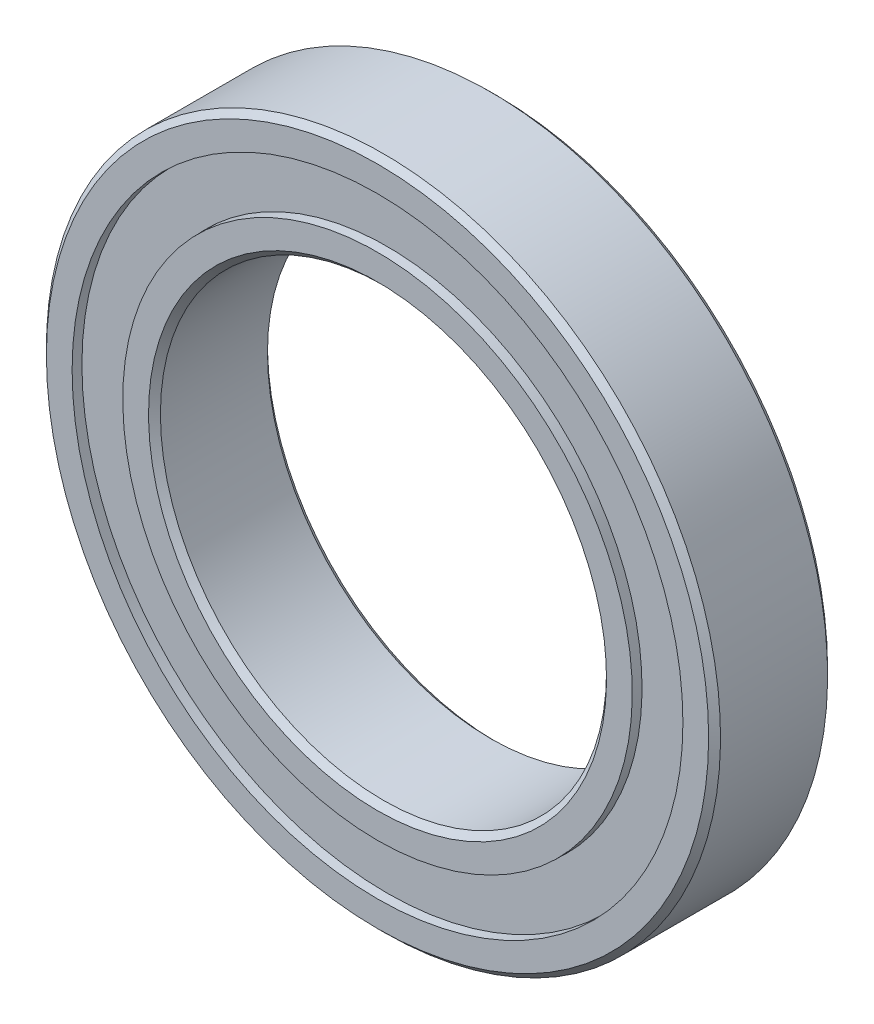
ISO-10303-21;
HEADER;
FILE_DESCRIPTION(('STEP AP214'),'2;1');
FILE_NAME('part.step','',(''),(''),'','','');
FILE_SCHEMA(('AUTOMOTIVE_DESIGN { 1 0 10303 214 1 1 1 1 }'));
ENDSEC;
DATA;
#1=APPLICATION_CONTEXT('core data for automotive mechanical design processes');
#2=APPLICATION_PROTOCOL_DEFINITION('international standard','automotive_design',2000,#1);
#3=PRODUCT_CONTEXT('',#1,'mechanical');
#4=PRODUCT('Part','Part','',(#3));
#5=PRODUCT_RELATED_PRODUCT_CATEGORY('part','',(#4));
#6=PRODUCT_DEFINITION_FORMATION('','',#4);
#7=PRODUCT_DEFINITION_CONTEXT('part definition',#1,'design');
#8=PRODUCT_DEFINITION('design','',#6,#7);
#9=PRODUCT_DEFINITION_SHAPE('','',#8);
#10=(LENGTH_UNIT() NAMED_UNIT(*) SI_UNIT(.MILLI.,.METRE.));
#11=(NAMED_UNIT(*) PLANE_ANGLE_UNIT() SI_UNIT($,.RADIAN.));
#12=(NAMED_UNIT(*) SI_UNIT($,.STERADIAN.) SOLID_ANGLE_UNIT());
#13=UNCERTAINTY_MEASURE_WITH_UNIT(LENGTH_MEASURE(1.E-05),#10,'distance_accuracy_value','');
#14=(GEOMETRIC_REPRESENTATION_CONTEXT(3) GLOBAL_UNCERTAINTY_ASSIGNED_CONTEXT((#13)) GLOBAL_UNIT_ASSIGNED_CONTEXT((#10,
#11,#12)) REPRESENTATION_CONTEXT('',''));
#15=CARTESIAN_POINT('',(0.,0.,0.));
#16=DIRECTION('',(0.,0.,1.));
#17=DIRECTION('',(1.,0.,0.));
#18=AXIS2_PLACEMENT_3D('',#15,#16,#17);
#19=CARTESIAN_POINT('',(11.490310166891,25.8076591784036,0.));
#20=DIRECTION('',(0.,0.,1.));
#21=DIRECTION('',(0.406736643075789,0.913545457642606,0.));
#22=AXIS2_PLACEMENT_3D('',#19,#20,#21);
#23=SPHERICAL_SURFACE('',#22,3.69350447524326);
#24=CARTESIAN_POINT('',(11.490310166891,25.8076591784036,3.69350447524325));
#25=VERTEX_POINT('',#24);
#26=VERTEX_LOOP('',#25);
#27=FACE_BOUND('',#26,.T.);
#28=ADVANCED_FACE('F39',(#27),#23,.T.);
#29=CLOSED_SHELL('',(#28));
#30=MANIFOLD_SOLID_BREP('B2',#29);
#31=CARTESIAN_POINT('',(20.9938413197362,18.902939629638,0.));
#32=DIRECTION('',(0.,0.,1.));
#33=DIRECTION('',(0.743144825477386,0.669130606358867,0.));
#34=AXIS2_PLACEMENT_3D('',#31,#32,#33);
#35=SPHERICAL_SURFACE('',#34,3.69350447524326);
#36=CARTESIAN_POINT('',(20.9938413197362,18.902939629638,3.69350447524325));
#37=VERTEX_POINT('',#36);
#38=VERTEX_LOOP('',#37);
#39=FACE_BOUND('',#38,.T.);
#40=ADVANCED_FACE('F59',(#39),#35,.T.);
#41=CLOSED_SHELL('',(#40));
#42=MANIFOLD_SOLID_BREP('B6',#41);
#43=CARTESIAN_POINT('',(26.867346585338,8.72973009109255,0.));
#44=DIRECTION('',(0.,0.,1.));
#45=DIRECTION('',(0.95105651629515,0.309016994374957,0.));
#46=AXIS2_PLACEMENT_3D('',#43,#44,#45);
#47=SPHERICAL_SURFACE('',#46,3.69350447524326);
#48=CARTESIAN_POINT('',(26.867346585338,8.72973009109255,3.69350447524325));
#49=VERTEX_POINT('',#48);
#50=VERTEX_LOOP('',#49);
#51=FACE_BOUND('',#50,.T.);
#52=ADVANCED_FACE('F79',(#51),#47,.T.);
#53=CLOSED_SHELL('',(#52));
#54=MANIFOLD_SOLID_BREP('B35',#53);
#55=CARTESIAN_POINT('',(28.0952435441538,-2.95292908731093,0.));
#56=DIRECTION('',(0.,0.,1.));
#57=DIRECTION('',(0.994521895368274,-0.104528463267644,0.));
#58=AXIS2_PLACEMENT_3D('',#55,#56,#57);
#59=SPHERICAL_SURFACE('',#58,3.69350447524326);
#60=CARTESIAN_POINT('',(28.0952435441538,-2.95292908731093,3.69350447524325));
#61=VERTEX_POINT('',#60);
#62=VERTEX_LOOP('',#61);
#63=FACE_BOUND('',#62,.T.);
#64=ADVANCED_FACE('F99',(#63),#59,.T.);
#65=CLOSED_SHELL('',(#64));
#66=MANIFOLD_SOLID_BREP('B55',#65);
#67=CARTESIAN_POINT('',(24.4652176569105,-14.1249999999998,0.));
#68=DIRECTION('',(0.,0.,1.));
#69=DIRECTION('',(0.866025403784443,-0.499999999999992,0.));
#70=AXIS2_PLACEMENT_3D('',#67,#68,#69);
#71=SPHERICAL_SURFACE('',#70,3.69350447524326);
#72=CARTESIAN_POINT('',(24.4652176569105,-14.1249999999998,3.69350447524325));
#73=VERTEX_POINT('',#72);
#74=VERTEX_LOOP('',#73);
#75=FACE_BOUND('',#74,.T.);
#76=ADVANCED_FACE('F119',(#75),#71,.T.);
#77=CLOSED_SHELL('',(#76));
#78=MANIFOLD_SOLID_BREP('B75',#77);
#79=CARTESIAN_POINT('',(16.6049333772626,-22.8547300910921,0.));
#80=DIRECTION('',(0.,0.,1.));
#81=DIRECTION('',(0.58778525229248,-0.809016994374943,0.));
#82=AXIS2_PLACEMENT_3D('',#79,#80,#81);
#83=SPHERICAL_SURFACE('',#82,3.69350447524326);
#84=CARTESIAN_POINT('',(16.6049333772626,-22.8547300910921,3.69350447524325));
#85=VERTEX_POINT('',#84);
#86=VERTEX_LOOP('',#85);
#87=FACE_BOUND('',#86,.T.);
#88=ADVANCED_FACE('F139',(#87),#83,.T.);
#89=CLOSED_SHELL('',(#88));
#90=MANIFOLD_SOLID_BREP('B95',#89);
#91=CARTESIAN_POINT('',(5.8735052656019,-27.63266972073,0.));
#92=DIRECTION('',(0.,0.,1.));
#93=DIRECTION('',(0.207911690817766,-0.978147600733804,0.));
#94=AXIS2_PLACEMENT_3D('',#91,#92,#93);
#95=SPHERICAL_SURFACE('',#94,3.69350447524326);
#96=CARTESIAN_POINT('',(5.8735052656019,-27.63266972073,3.69350447524325));
#97=VERTEX_POINT('',#96);
#98=VERTEX_LOOP('',#97);
#99=FACE_BOUND('',#98,.T.);
#100=ADVANCED_FACE('F159',(#99),#95,.T.);
#101=CLOSED_SHELL('',(#100));
#102=MANIFOLD_SOLID_BREP('B115',#101);
#103=CARTESIAN_POINT('',(-5.87350526560153,-27.63266972073,0.));
#104=DIRECTION('',(0.,0.,1.));
#105=DIRECTION('',(-0.207911690817753,-0.978147600733807,0.));
#106=AXIS2_PLACEMENT_3D('',#103,#104,#105);
#107=SPHERICAL_SURFACE('',#106,3.69350447524326);
#108=CARTESIAN_POINT('',(-5.87350526560153,-27.63266972073,3.69350447524325));
#109=VERTEX_POINT('',#108);
#110=VERTEX_LOOP('',#109);
#111=FACE_BOUND('',#110,.T.);
#112=ADVANCED_FACE('F179',(#111),#107,.T.);
#113=CLOSED_SHELL('',(#112));
#114=MANIFOLD_SOLID_BREP('B135',#113);
#115=CARTESIAN_POINT('',(-16.6049333772622,-22.8547300910924,0.));
#116=DIRECTION('',(0.,0.,1.));
#117=DIRECTION('',(-0.587785252292469,-0.80901699437495,0.));
#118=AXIS2_PLACEMENT_3D('',#115,#116,#117);
#119=SPHERICAL_SURFACE('',#118,3.69350447524326);
#120=CARTESIAN_POINT('',(-16.6049333772622,-22.8547300910924,3.69350447524325));
#121=VERTEX_POINT('',#120);
#122=VERTEX_LOOP('',#121);
#123=FACE_BOUND('',#122,.T.);
#124=ADVANCED_FACE('F199',(#123),#119,.T.);
#125=CLOSED_SHELL('',(#124));
#126=MANIFOLD_SOLID_BREP('B155',#125);
#127=CARTESIAN_POINT('',(-24.4652176569103,-14.1250000000001,0.));
#128=DIRECTION('',(0.,0.,1.));
#129=DIRECTION('',(-0.866025403784436,-0.500000000000004,0.));
#130=AXIS2_PLACEMENT_3D('',#127,#128,#129);
#131=SPHERICAL_SURFACE('',#130,3.69350447524326);
#132=CARTESIAN_POINT('',(-24.4652176569103,-14.1250000000001,3.69350447524325));
#133=VERTEX_POINT('',#132);
#134=VERTEX_LOOP('',#133);
#135=FACE_BOUND('',#134,.T.);
#136=ADVANCED_FACE('F219',(#135),#131,.T.);
#137=CLOSED_SHELL('',(#136));
#138=MANIFOLD_SOLID_BREP('B175',#137);
#139=CARTESIAN_POINT('',(-28.0952435441537,-2.95292908731131,0.));
#140=DIRECTION('',(0.,0.,1.));
#141=DIRECTION('',(-0.994521895368273,-0.104528463267657,0.));
#142=AXIS2_PLACEMENT_3D('',#139,#140,#141);
#143=SPHERICAL_SURFACE('',#142,3.69350447524326);
#144=CARTESIAN_POINT('',(-28.0952435441537,-2.95292908731131,3.69350447524325));
#145=VERTEX_POINT('',#144);
#146=VERTEX_LOOP('',#145);
#147=FACE_BOUND('',#146,.T.);
#148=ADVANCED_FACE('F239',(#147),#143,.T.);
#149=CLOSED_SHELL('',(#148));
#150=MANIFOLD_SOLID_BREP('B195',#149);
#151=CARTESIAN_POINT('',(-26.8673465853381,8.7297300910922,0.));
#152=DIRECTION('',(0.,0.,1.));
#153=DIRECTION('',(-0.951056516295154,0.309016994374945,0.));
#154=AXIS2_PLACEMENT_3D('',#151,#152,#153);
#155=SPHERICAL_SURFACE('',#154,3.69350447524326);
#156=CARTESIAN_POINT('',(-26.8673465853381,8.7297300910922,3.69350447524325));
#157=VERTEX_POINT('',#156);
#158=VERTEX_LOOP('',#157);
#159=FACE_BOUND('',#158,.T.);
#160=ADVANCED_FACE('F259',(#159),#155,.T.);
#161=CLOSED_SHELL('',(#160));
#162=MANIFOLD_SOLID_BREP('B215',#161);
#163=CARTESIAN_POINT('',(-20.9938413197364,18.9029396296377,0.));
#164=DIRECTION('',(0.,0.,1.));
#165=DIRECTION('',(-0.743144825477395,0.669130606358857,0.));
#166=AXIS2_PLACEMENT_3D('',#163,#164,#165);
#167=SPHERICAL_SURFACE('',#166,3.69350447524326);
#168=CARTESIAN_POINT('',(-20.9938413197364,18.9029396296377,3.69350447524325));
#169=VERTEX_POINT('',#168);
#170=VERTEX_LOOP('',#169);
#171=FACE_BOUND('',#170,.T.);
#172=ADVANCED_FACE('F279',(#171),#167,.T.);
#173=CLOSED_SHELL('',(#172));
#174=MANIFOLD_SOLID_BREP('B235',#173);
#175=CARTESIAN_POINT('',(-11.4903101668914,25.8076591784035,0.));
#176=DIRECTION('',(0.,0.,1.));
#177=DIRECTION('',(-0.406736643075801,0.913545457642601,0.));
#178=AXIS2_PLACEMENT_3D('',#175,#176,#177);
#179=SPHERICAL_SURFACE('',#178,3.69350447524326);
#180=CARTESIAN_POINT('',(-11.4903101668914,25.8076591784035,3.69350447524325));
#181=VERTEX_POINT('',#180);
#182=VERTEX_LOOP('',#181);
#183=FACE_BOUND('',#182,.T.);
#184=ADVANCED_FACE('F299',(#183),#179,.T.);
#185=CLOSED_SHELL('',(#184));
#186=MANIFOLD_SOLID_BREP('B255',#185);
#187=CARTESIAN_POINT('',(0.,28.25,0.));
#188=DIRECTION('',(0.,0.,1.));
#189=DIRECTION('',(0.,1.,0.));
#190=AXIS2_PLACEMENT_3D('',#187,#188,#189);
#191=SPHERICAL_SURFACE('',#190,3.69350447524326);
#192=CARTESIAN_POINT('',(0.,28.25,3.69350447524325));
#193=VERTEX_POINT('',#192);
#194=VERTEX_LOOP('',#193);
#195=FACE_BOUND('',#194,.T.);
#196=ADVANCED_FACE('F321',(#195),#191,.T.);
#197=CLOSED_SHELL('',(#196));
#198=MANIFOLD_SOLID_BREP('B275',#197);
#199=CARTESIAN_POINT('',(0.,25.6944444444445,6.00000000000003));
#200=DIRECTION('',(0.,0.,-1.));
#201=DIRECTION('',(0.,1.,0.));
#202=AXIS2_PLACEMENT_3D('',#199,#200,#201);
#203=PLANE('',#202);
#204=CARTESIAN_POINT('',(0.,0.,6.00000000000002));
#205=DIRECTION('',(0.,0.,1.));
#206=DIRECTION('',(0.,-1.,0.));
#207=AXIS2_PLACEMENT_3D('',#204,#205,#206);
#208=CIRCLE('',#207,23.1);
#209=CARTESIAN_POINT('',(0.,-23.1,6.00000000000002));
#210=VERTEX_POINT('',#209);
#211=EDGE_CURVE('E369',#210,#210,#208,.T.);
#212=ORIENTED_EDGE('',*,*,#211,.F.);
#213=EDGE_LOOP('',(#212));
#214=FACE_BOUND('',#213,.T.);
#215=CARTESIAN_POINT('',(0.,0.,6.00000000000002));
#216=DIRECTION('',(0.,0.,1.));
#217=DIRECTION('',(0.,-1.,0.));
#218=AXIS2_PLACEMENT_3D('',#215,#216,#217);
#219=CIRCLE('',#218,25.6944444444445);
#220=CARTESIAN_POINT('',(0.,-25.6944444444445,6.00000000000002));
#221=VERTEX_POINT('',#220);
#222=EDGE_CURVE('E320',#221,#221,#219,.T.);
#223=ORIENTED_EDGE('',*,*,#222,.T.);
#224=EDGE_LOOP('',(#223));
#225=FACE_BOUND('',#224,.T.);
#226=ADVANCED_FACE('F341',(#214,#225),#203,.F.);
#227=CARTESIAN_POINT('',(0.,0.,6.00000000000002));
#228=DIRECTION('',(0.,0.,1.));
#229=DIRECTION('',(0.,-1.,0.));
#230=AXIS2_PLACEMENT_3D('',#227,#228,#229);
#231=CYLINDRICAL_SURFACE('',#230,25.6944444444445);
#232=ORIENTED_EDGE('',*,*,#222,.F.);
#233=EDGE_LOOP('',(#232));
#234=FACE_BOUND('',#233,.T.);
#235=CARTESIAN_POINT('',(0.,0.,2.66666666666666));
#236=DIRECTION('',(0.,0.,1.));
#237=DIRECTION('',(0.,-1.,0.));
#238=AXIS2_PLACEMENT_3D('',#235,#236,#237);
#239=CIRCLE('',#238,25.6944444444445);
#240=CARTESIAN_POINT('',(0.,-25.6944444444445,2.66666666666666));
#241=VERTEX_POINT('',#240);
#242=EDGE_CURVE('E347',#241,#241,#239,.T.);
#243=ORIENTED_EDGE('',*,*,#242,.T.);
#244=EDGE_LOOP('',(#243));
#245=FACE_BOUND('',#244,.T.);
#246=ADVANCED_FACE('F376',(#234,#245),#231,.T.);
#247=CARTESIAN_POINT('',(0.,0.,0.));
#248=DIRECTION('',(0.,0.,1.));
#249=DIRECTION('',(0.,-1.,0.));
#250=AXIS2_PLACEMENT_3D('',#247,#248,#249);
#251=TOROIDAL_SURFACE('',#250,28.25,3.69350447524326);
#252=ORIENTED_EDGE('',*,*,#242,.F.);
#253=EDGE_LOOP('',(#252));
#254=FACE_BOUND('',#253,.T.);
#255=CARTESIAN_POINT('',(0.,0.,-2.66666666666667));
#256=DIRECTION('',(0.,0.,1.));
#257=DIRECTION('',(0.,-1.,0.));
#258=AXIS2_PLACEMENT_3D('',#255,#256,#257);
#259=CIRCLE('',#258,25.6944444444445);
#260=CARTESIAN_POINT('',(0.,-25.6944444444445,-2.66666666666667));
#261=VERTEX_POINT('',#260);
#262=EDGE_CURVE('E351',#261,#261,#259,.T.);
#263=ORIENTED_EDGE('',*,*,#262,.T.);
#264=EDGE_LOOP('',(#263));
#265=FACE_BOUND('',#264,.T.);
#266=ADVANCED_FACE('F380',(#254,#265),#251,.F.);
#267=CARTESIAN_POINT('',(0.,0.,6.00000000000002));
#268=DIRECTION('',(0.,0.,1.));
#269=DIRECTION('',(0.,-1.,0.));
#270=AXIS2_PLACEMENT_3D('',#267,#268,#269);
#271=CYLINDRICAL_SURFACE('',#270,25.6944444444445);
#272=ORIENTED_EDGE('',*,*,#262,.F.);
#273=EDGE_LOOP('',(#272));
#274=FACE_BOUND('',#273,.T.);
#275=CARTESIAN_POINT('',(0.,0.,-6.00000000000003));
#276=DIRECTION('',(0.,0.,1.));
#277=DIRECTION('',(0.,-1.,0.));
#278=AXIS2_PLACEMENT_3D('',#275,#276,#277);
#279=CIRCLE('',#278,25.6944444444445);
#280=CARTESIAN_POINT('',(0.,-25.6944444444445,-6.00000000000003));
#281=VERTEX_POINT('',#280);
#282=EDGE_CURVE('E355',#281,#281,#279,.T.);
#283=ORIENTED_EDGE('',*,*,#282,.T.);
#284=EDGE_LOOP('',(#283));
#285=FACE_BOUND('',#284,.T.);
#286=ADVANCED_FACE('F385',(#274,#285),#271,.T.);
#287=CARTESIAN_POINT('',(0.,23.1,-6.00000000000003));
#288=DIRECTION('',(0.,0.,1.));
#289=DIRECTION('',(0.,-1.,0.));
#290=AXIS2_PLACEMENT_3D('',#287,#288,#289);
#291=PLANE('',#290);
#292=ORIENTED_EDGE('',*,*,#282,.F.);
#293=EDGE_LOOP('',(#292));
#294=FACE_BOUND('',#293,.T.);
#295=CARTESIAN_POINT('',(0.,0.,-6.00000000000003));
#296=DIRECTION('',(0.,0.,1.));
#297=DIRECTION('',(0.,-1.,0.));
#298=AXIS2_PLACEMENT_3D('',#295,#296,#297);
#299=CIRCLE('',#298,23.1);
#300=CARTESIAN_POINT('',(0.,-23.1,-6.00000000000003));
#301=VERTEX_POINT('',#300);
#302=EDGE_CURVE('E360',#301,#301,#299,.T.);
#303=ORIENTED_EDGE('',*,*,#302,.T.);
#304=EDGE_LOOP('',(#303));
#305=FACE_BOUND('',#304,.T.);
#306=ADVANCED_FACE('F391',(#294,#305),#291,.F.);
#307=CARTESIAN_POINT('',(0.,0.,-5.40000000000003));
#308=DIRECTION('',(0.,0.,-1.));
#309=DIRECTION('',(0.,1.,0.));
#310=AXIS2_PLACEMENT_3D('',#307,#308,#309);
#311=CONICAL_SURFACE('',#310,22.5,0.785398163397431);
#312=ORIENTED_EDGE('',*,*,#302,.F.);
#313=EDGE_LOOP('',(#312));
#314=FACE_BOUND('',#313,.T.);
#315=CARTESIAN_POINT('',(0.,0.,-5.40000000000003));
#316=DIRECTION('',(0.,0.,1.));
#317=DIRECTION('',(0.,-1.,0.));
#318=AXIS2_PLACEMENT_3D('',#315,#316,#317);
#319=CIRCLE('',#318,22.5);
#320=CARTESIAN_POINT('',(0.,-22.5,-5.40000000000003));
#321=VERTEX_POINT('',#320);
#322=EDGE_CURVE('E363',#321,#321,#319,.T.);
#323=ORIENTED_EDGE('',*,*,#322,.T.);
#324=EDGE_LOOP('',(#323));
#325=FACE_BOUND('',#324,.T.);
#326=ADVANCED_FACE('F395',(#314,#325),#311,.F.);
#327=CARTESIAN_POINT('',(0.,0.,6.00000000000002));
#328=DIRECTION('',(0.,0.,1.));
#329=DIRECTION('',(0.,-1.,0.));
#330=AXIS2_PLACEMENT_3D('',#327,#328,#329);
#331=CYLINDRICAL_SURFACE('',#330,22.5);
#332=ORIENTED_EDGE('',*,*,#322,.F.);
#333=EDGE_LOOP('',(#332));
#334=FACE_BOUND('',#333,.T.);
#335=CARTESIAN_POINT('',(0.,0.,5.40000000000004));
#336=DIRECTION('',(0.,0.,1.));
#337=DIRECTION('',(0.,-1.,0.));
#338=AXIS2_PLACEMENT_3D('',#335,#336,#337);
#339=CIRCLE('',#338,22.5);
#340=CARTESIAN_POINT('',(0.,-22.5,5.40000000000004));
#341=VERTEX_POINT('',#340);
#342=EDGE_CURVE('E366',#341,#341,#339,.T.);
#343=ORIENTED_EDGE('',*,*,#342,.T.);
#344=EDGE_LOOP('',(#343));
#345=FACE_BOUND('',#344,.T.);
#346=ADVANCED_FACE('F399',(#334,#345),#331,.F.);
#347=CARTESIAN_POINT('',(0.,0.,6.00000000000002));
#348=DIRECTION('',(0.,0.,1.));
#349=DIRECTION('',(0.,-1.,0.));
#350=AXIS2_PLACEMENT_3D('',#347,#348,#349);
#351=CONICAL_SURFACE('',#350,23.1,0.785398163397474);
#352=ORIENTED_EDGE('',*,*,#342,.F.);
#353=EDGE_LOOP('',(#352));
#354=FACE_BOUND('',#353,.T.);
#355=ORIENTED_EDGE('',*,*,#211,.T.);
#356=EDGE_LOOP('',(#355));
#357=FACE_BOUND('',#356,.T.);
#358=ADVANCED_FACE('F373',(#354,#357),#351,.F.);
#359=CLOSED_SHELL('',(#226,#246,#266,#286,#306,#326,#346,#358));
#360=MANIFOLD_SOLID_BREP('B295',#359);
#361=CARTESIAN_POINT('',(0.,25.7198444444445,-4.65625223762164));
#362=DIRECTION('',(0.,0.,-1.));
#363=DIRECTION('',(0.,1.,0.));
#364=AXIS2_PLACEMENT_3D('',#361,#362,#363);
#365=PLANE('',#364);
#366=CARTESIAN_POINT('',(0.,0.,-4.65625223762165));
#367=DIRECTION('',(0.,0.,1.));
#368=DIRECTION('',(0.,-1.,0.));
#369=AXIS2_PLACEMENT_3D('',#366,#367,#368);
#370=CIRCLE('',#369,25.7198444444445);
#371=CARTESIAN_POINT('',(0.,-25.7198444444445,-4.65625223762165));
#372=VERTEX_POINT('',#371);
#373=EDGE_CURVE('E484',#372,#372,#370,.T.);
#374=ORIENTED_EDGE('',*,*,#373,.F.);
#375=EDGE_LOOP('',(#374));
#376=FACE_BOUND('',#375,.T.);
#377=CARTESIAN_POINT('',(0.,0.,-4.65625223762165));
#378=DIRECTION('',(0.,0.,1.));
#379=DIRECTION('',(0.,-1.,0.));
#380=AXIS2_PLACEMENT_3D('',#377,#378,#379);
#381=CIRCLE('',#380,30.7801555555556);
#382=CARTESIAN_POINT('',(0.,-30.7801555555556,-4.65625223762165));
#383=VERTEX_POINT('',#382);
#384=EDGE_CURVE('E340',#383,#383,#381,.T.);
#385=ORIENTED_EDGE('',*,*,#384,.T.);
#386=EDGE_LOOP('',(#385));
#387=FACE_BOUND('',#386,.T.);
#388=ADVANCED_FACE('F470',(#376,#387),#365,.F.);
#389=CARTESIAN_POINT('',(0.,0.,6.00000000000002));
#390=DIRECTION('',(0.,0.,1.));
#391=DIRECTION('',(0.,-1.,0.));
#392=AXIS2_PLACEMENT_3D('',#389,#390,#391);
#393=CYLINDRICAL_SURFACE('',#392,30.7801555555556);
#394=ORIENTED_EDGE('',*,*,#384,.F.);
#395=EDGE_LOOP('',(#394));
#396=FACE_BOUND('',#395,.T.);
#397=CARTESIAN_POINT('',(0.,0.,-5.03725223762165));
#398=DIRECTION('',(0.,0.,1.));
#399=DIRECTION('',(0.,-1.,0.));
#400=AXIS2_PLACEMENT_3D('',#397,#398,#399);
#401=CIRCLE('',#400,30.7801555555556);
#402=CARTESIAN_POINT('',(0.,-30.7801555555556,-5.03725223762165));
#403=VERTEX_POINT('',#402);
#404=EDGE_CURVE('E476',#403,#403,#401,.T.);
#405=ORIENTED_EDGE('',*,*,#404,.T.);
#406=EDGE_LOOP('',(#405));
#407=FACE_BOUND('',#406,.T.);
#408=ADVANCED_FACE('F493',(#396,#407),#393,.T.);
#409=CARTESIAN_POINT('',(0.,25.7198444444445,-5.03725223762164));
#410=DIRECTION('',(0.,0.,1.));
#411=DIRECTION('',(0.,-1.,0.));
#412=AXIS2_PLACEMENT_3D('',#409,#410,#411);
#413=PLANE('',#412);
#414=ORIENTED_EDGE('',*,*,#404,.F.);
#415=EDGE_LOOP('',(#414));
#416=FACE_BOUND('',#415,.T.);
#417=CARTESIAN_POINT('',(0.,0.,-5.03725223762165));
#418=DIRECTION('',(0.,0.,1.));
#419=DIRECTION('',(0.,-1.,0.));
#420=AXIS2_PLACEMENT_3D('',#417,#418,#419);
#421=CIRCLE('',#420,25.7198444444445);
#422=CARTESIAN_POINT('',(0.,-25.7198444444445,-5.03725223762165));
#423=VERTEX_POINT('',#422);
#424=EDGE_CURVE('E480',#423,#423,#421,.T.);
#425=ORIENTED_EDGE('',*,*,#424,.T.);
#426=EDGE_LOOP('',(#425));
#427=FACE_BOUND('',#426,.T.);
#428=ADVANCED_FACE('F497',(#416,#427),#413,.F.);
#429=CARTESIAN_POINT('',(0.,0.,6.00000000000002));
#430=DIRECTION('',(0.,0.,1.));
#431=DIRECTION('',(0.,-1.,0.));
#432=AXIS2_PLACEMENT_3D('',#429,#430,#431);
#433=CYLINDRICAL_SURFACE('',#432,25.7198444444445);
#434=ORIENTED_EDGE('',*,*,#424,.F.);
#435=EDGE_LOOP('',(#434));
#436=FACE_BOUND('',#435,.T.);
#437=ORIENTED_EDGE('',*,*,#373,.T.);
#438=EDGE_LOOP('',(#437));
#439=FACE_BOUND('',#438,.T.);
#440=ADVANCED_FACE('F490',(#436,#439),#433,.F.);
#441=CLOSED_SHELL('',(#388,#408,#428,#440));
#442=MANIFOLD_SOLID_BREP('B315',#441);
#443=CARTESIAN_POINT('',(0.,25.7198444444445,5.03725223762163));
#444=DIRECTION('',(0.,0.,-1.));
#445=DIRECTION('',(0.,1.,0.));
#446=AXIS2_PLACEMENT_3D('',#443,#444,#445);
#447=PLANE('',#446);
#448=CARTESIAN_POINT('',(0.,0.,5.03725223762163));
#449=DIRECTION('',(0.,0.,1.));
#450=DIRECTION('',(0.,-1.,0.));
#451=AXIS2_PLACEMENT_3D('',#448,#449,#450);
#452=CIRCLE('',#451,25.7198444444445);
#453=CARTESIAN_POINT('',(0.,-25.7198444444445,5.03725223762163));
#454=VERTEX_POINT('',#453);
#455=EDGE_CURVE('E469',#454,#454,#452,.T.);
#456=ORIENTED_EDGE('',*,*,#455,.F.);
#457=EDGE_LOOP('',(#456));
#458=FACE_BOUND('',#457,.T.);
#459=CARTESIAN_POINT('',(0.,0.,5.03725223762163));
#460=DIRECTION('',(0.,0.,1.));
#461=DIRECTION('',(0.,-1.,0.));
#462=AXIS2_PLACEMENT_3D('',#459,#460,#461);
#463=CIRCLE('',#462,30.7801555555556);
#464=CARTESIAN_POINT('',(0.,-30.7801555555556,5.03725223762163));
#465=VERTEX_POINT('',#464);
#466=EDGE_CURVE('E552',#465,#465,#463,.T.);
#467=ORIENTED_EDGE('',*,*,#466,.T.);
#468=EDGE_LOOP('',(#467));
#469=FACE_BOUND('',#468,.T.);
#470=ADVANCED_FACE('F538',(#458,#469),#447,.F.);
#471=CARTESIAN_POINT('',(0.,0.,6.00000000000002));
#472=DIRECTION('',(0.,0.,1.));
#473=DIRECTION('',(0.,-1.,0.));
#474=AXIS2_PLACEMENT_3D('',#471,#472,#473);
#475=CYLINDRICAL_SURFACE('',#474,25.7198444444445);
#476=CARTESIAN_POINT('',(0.,0.,4.65625223762163));
#477=DIRECTION('',(0.,0.,1.));
#478=DIRECTION('',(0.,-1.,0.));
#479=AXIS2_PLACEMENT_3D('',#476,#477,#478);
#480=CIRCLE('',#479,25.7198444444445);
#481=CARTESIAN_POINT('',(0.,-25.7198444444445,4.65625223762163));
#482=VERTEX_POINT('',#481);
#483=EDGE_CURVE('E544',#482,#482,#480,.T.);
#484=ORIENTED_EDGE('',*,*,#483,.F.);
#485=EDGE_LOOP('',(#484));
#486=FACE_BOUND('',#485,.T.);
#487=ORIENTED_EDGE('',*,*,#455,.T.);
#488=EDGE_LOOP('',(#487));
#489=FACE_BOUND('',#488,.T.);
#490=ADVANCED_FACE('F567',(#486,#489),#475,.F.);
#491=CARTESIAN_POINT('',(0.,25.7198444444445,4.65625223762164));
#492=DIRECTION('',(0.,0.,1.));
#493=DIRECTION('',(0.,-1.,0.));
#494=AXIS2_PLACEMENT_3D('',#491,#492,#493);
#495=PLANE('',#494);
#496=CARTESIAN_POINT('',(0.,0.,4.65625223762163));
#497=DIRECTION('',(0.,0.,1.));
#498=DIRECTION('',(0.,-1.,0.));
#499=AXIS2_PLACEMENT_3D('',#496,#497,#498);
#500=CIRCLE('',#499,30.7801555555556);
#501=CARTESIAN_POINT('',(0.,-30.7801555555556,4.65625223762163));
#502=VERTEX_POINT('',#501);
#503=EDGE_CURVE('E548',#502,#502,#500,.T.);
#504=ORIENTED_EDGE('',*,*,#503,.F.);
#505=EDGE_LOOP('',(#504));
#506=FACE_BOUND('',#505,.T.);
#507=ORIENTED_EDGE('',*,*,#483,.T.);
#508=EDGE_LOOP('',(#507));
#509=FACE_BOUND('',#508,.T.);
#510=ADVANCED_FACE('F562',(#506,#509),#495,.F.);
#511=CARTESIAN_POINT('',(0.,0.,6.00000000000002));
#512=DIRECTION('',(0.,0.,1.));
#513=DIRECTION('',(0.,-1.,0.));
#514=AXIS2_PLACEMENT_3D('',#511,#512,#513);
#515=CYLINDRICAL_SURFACE('',#514,30.7801555555556);
#516=ORIENTED_EDGE('',*,*,#466,.F.);
#517=EDGE_LOOP('',(#516));
#518=FACE_BOUND('',#517,.T.);
#519=ORIENTED_EDGE('',*,*,#503,.T.);
#520=EDGE_LOOP('',(#519));
#521=FACE_BOUND('',#520,.T.);
#522=ADVANCED_FACE('F559',(#518,#521),#515,.T.);
#523=CLOSED_SHELL('',(#470,#490,#510,#522));
#524=MANIFOLD_SOLID_BREP('B335',#523);
#525=CARTESIAN_POINT('',(0.,0.,5.40000000000001));
#526=DIRECTION('',(0.,0.,-1.));
#527=DIRECTION('',(0.,1.,0.));
#528=AXIS2_PLACEMENT_3D('',#525,#526,#527);
#529=CONICAL_SURFACE('',#528,34.,0.78539816339744);
#530=CARTESIAN_POINT('',(0.,0.,6.00000000000001));
#531=DIRECTION('',(0.,0.,1.));
#532=DIRECTION('',(0.,-1.,0.));
#533=AXIS2_PLACEMENT_3D('',#530,#531,#532);
#534=CIRCLE('',#533,33.4);
#535=CARTESIAN_POINT('',(0.,-33.4,6.00000000000001));
#536=VERTEX_POINT('',#535);
#537=EDGE_CURVE('E627',#536,#536,#534,.T.);
#538=ORIENTED_EDGE('',*,*,#537,.F.);
#539=EDGE_LOOP('',(#538));
#540=FACE_BOUND('',#539,.T.);
#541=CARTESIAN_POINT('',(0.,0.,5.40000000000001));
#542=DIRECTION('',(0.,0.,1.));
#543=DIRECTION('',(0.,-1.,0.));
#544=AXIS2_PLACEMENT_3D('',#541,#542,#543);
#545=CIRCLE('',#544,34.);
#546=CARTESIAN_POINT('',(0.,-34.,5.40000000000001));
#547=VERTEX_POINT('',#546);
#548=EDGE_CURVE('E537',#547,#547,#545,.T.);
#549=ORIENTED_EDGE('',*,*,#548,.T.);
#550=EDGE_LOOP('',(#549));
#551=FACE_BOUND('',#550,.T.);
#552=ADVANCED_FACE('F599',(#540,#551),#529,.T.);
#553=CARTESIAN_POINT('',(0.,0.,6.00000000000002));
#554=DIRECTION('',(0.,0.,1.));
#555=DIRECTION('',(0.,-1.,0.));
#556=AXIS2_PLACEMENT_3D('',#553,#554,#555);
#557=CYLINDRICAL_SURFACE('',#556,34.);
#558=ORIENTED_EDGE('',*,*,#548,.F.);
#559=EDGE_LOOP('',(#558));
#560=FACE_BOUND('',#559,.T.);
#561=CARTESIAN_POINT('',(0.,0.,-5.40000000000003));
#562=DIRECTION('',(0.,0.,1.));
#563=DIRECTION('',(0.,-1.,0.));
#564=AXIS2_PLACEMENT_3D('',#561,#562,#563);
#565=CIRCLE('',#564,34.);
#566=CARTESIAN_POINT('',(0.,-34.,-5.40000000000003));
#567=VERTEX_POINT('',#566);
#568=EDGE_CURVE('E605',#567,#567,#565,.T.);
#569=ORIENTED_EDGE('',*,*,#568,.T.);
#570=EDGE_LOOP('',(#569));
#571=FACE_BOUND('',#570,.T.);
#572=ADVANCED_FACE('F634',(#560,#571),#557,.T.);
#573=CARTESIAN_POINT('',(0.,0.,-6.00000000000002));
#574=DIRECTION('',(0.,0.,1.));
#575=DIRECTION('',(0.,-1.,0.));
#576=AXIS2_PLACEMENT_3D('',#573,#574,#575);
#577=CONICAL_SURFACE('',#576,33.4,0.78539816339744);
#578=ORIENTED_EDGE('',*,*,#568,.F.);
#579=EDGE_LOOP('',(#578));
#580=FACE_BOUND('',#579,.T.);
#581=CARTESIAN_POINT('',(0.,0.,-6.00000000000002));
#582=DIRECTION('',(0.,0.,1.));
#583=DIRECTION('',(0.,-1.,0.));
#584=AXIS2_PLACEMENT_3D('',#581,#582,#583);
#585=CIRCLE('',#584,33.4);
#586=CARTESIAN_POINT('',(0.,-33.4,-6.00000000000003));
#587=VERTEX_POINT('',#586);
#588=EDGE_CURVE('E609',#587,#587,#585,.T.);
#589=ORIENTED_EDGE('',*,*,#588,.T.);
#590=EDGE_LOOP('',(#589));
#591=FACE_BOUND('',#590,.T.);
#592=ADVANCED_FACE('F638',(#580,#591),#577,.T.);
#593=CARTESIAN_POINT('',(0.,33.4,-6.00000000000002));
#594=DIRECTION('',(0.,0.,1.));
#595=DIRECTION('',(0.,-1.,0.));
#596=AXIS2_PLACEMENT_3D('',#593,#594,#595);
#597=PLANE('',#596);
#598=ORIENTED_EDGE('',*,*,#588,.F.);
#599=EDGE_LOOP('',(#598));
#600=FACE_BOUND('',#599,.T.);
#601=CARTESIAN_POINT('',(0.,0.,-6.00000000000003));
#602=DIRECTION('',(0.,0.,1.));
#603=DIRECTION('',(0.,-1.,0.));
#604=AXIS2_PLACEMENT_3D('',#601,#602,#603);
#605=CIRCLE('',#604,30.8055555555556);
#606=CARTESIAN_POINT('',(0.,-30.8055555555556,-6.00000000000003));
#607=VERTEX_POINT('',#606);
#608=EDGE_CURVE('E613',#607,#607,#605,.T.);
#609=ORIENTED_EDGE('',*,*,#608,.T.);
#610=EDGE_LOOP('',(#609));
#611=FACE_BOUND('',#610,.T.);
#612=ADVANCED_FACE('F643',(#600,#611),#597,.F.);
#613=CARTESIAN_POINT('',(0.,0.,6.00000000000002));
#614=DIRECTION('',(0.,0.,1.));
#615=DIRECTION('',(0.,-1.,0.));
#616=AXIS2_PLACEMENT_3D('',#613,#614,#615);
#617=CYLINDRICAL_SURFACE('',#616,30.8055555555556);
#618=ORIENTED_EDGE('',*,*,#608,.F.);
#619=EDGE_LOOP('',(#618));
#620=FACE_BOUND('',#619,.T.);
#621=CARTESIAN_POINT('',(0.,0.,-2.66666666666667));
#622=DIRECTION('',(0.,0.,1.));
#623=DIRECTION('',(0.,-1.,0.));
#624=AXIS2_PLACEMENT_3D('',#621,#622,#623);
#625=CIRCLE('',#624,30.8055555555556);
#626=CARTESIAN_POINT('',(0.,-30.8055555555556,-2.66666666666668));
#627=VERTEX_POINT('',#626);
#628=EDGE_CURVE('E618',#627,#627,#625,.T.);
#629=ORIENTED_EDGE('',*,*,#628,.T.);
#630=EDGE_LOOP('',(#629));
#631=FACE_BOUND('',#630,.T.);
#632=ADVANCED_FACE('F649',(#620,#631),#617,.F.);
#633=CARTESIAN_POINT('',(0.,0.,0.));
#634=DIRECTION('',(0.,0.,1.));
#635=DIRECTION('',(0.,-1.,0.));
#636=AXIS2_PLACEMENT_3D('',#633,#634,#635);
#637=TOROIDAL_SURFACE('',#636,28.25,3.69350447524326);
#638=ORIENTED_EDGE('',*,*,#628,.F.);
#639=EDGE_LOOP('',(#638));
#640=FACE_BOUND('',#639,.T.);
#641=CARTESIAN_POINT('',(0.,0.,2.66666666666666));
#642=DIRECTION('',(0.,0.,1.));
#643=DIRECTION('',(0.,-1.,0.));
#644=AXIS2_PLACEMENT_3D('',#641,#642,#643);
#645=CIRCLE('',#644,30.8055555555556);
#646=CARTESIAN_POINT('',(0.,-30.8055555555556,2.66666666666666));
#647=VERTEX_POINT('',#646);
#648=EDGE_CURVE('E621',#647,#647,#645,.T.);
#649=ORIENTED_EDGE('',*,*,#648,.T.);
#650=EDGE_LOOP('',(#649));
#651=FACE_BOUND('',#650,.T.);
#652=ADVANCED_FACE('F653',(#640,#651),#637,.F.);
#653=CARTESIAN_POINT('',(0.,0.,6.00000000000002));
#654=DIRECTION('',(0.,0.,1.));
#655=DIRECTION('',(0.,-1.,0.));
#656=AXIS2_PLACEMENT_3D('',#653,#654,#655);
#657=CYLINDRICAL_SURFACE('',#656,30.8055555555556);
#658=ORIENTED_EDGE('',*,*,#648,.F.);
#659=EDGE_LOOP('',(#658));
#660=FACE_BOUND('',#659,.T.);
#661=CARTESIAN_POINT('',(0.,0.,6.00000000000001));
#662=DIRECTION('',(0.,0.,1.));
#663=DIRECTION('',(0.,-1.,0.));
#664=AXIS2_PLACEMENT_3D('',#661,#662,#663);
#665=CIRCLE('',#664,30.8055555555556);
#666=CARTESIAN_POINT('',(0.,-30.8055555555556,6.00000000000001));
#667=VERTEX_POINT('',#666);
#668=EDGE_CURVE('E624',#667,#667,#665,.T.);
#669=ORIENTED_EDGE('',*,*,#668,.T.);
#670=EDGE_LOOP('',(#669));
#671=FACE_BOUND('',#670,.T.);
#672=ADVANCED_FACE('F657',(#660,#671),#657,.F.);
#673=CARTESIAN_POINT('',(0.,33.4,6.00000000000002));
#674=DIRECTION('',(0.,0.,-1.));
#675=DIRECTION('',(0.,1.,0.));
#676=AXIS2_PLACEMENT_3D('',#673,#674,#675);
#677=PLANE('',#676);
#678=ORIENTED_EDGE('',*,*,#668,.F.);
#679=EDGE_LOOP('',(#678));
#680=FACE_BOUND('',#679,.T.);
#681=ORIENTED_EDGE('',*,*,#537,.T.);
#682=EDGE_LOOP('',(#681));
#683=FACE_BOUND('',#682,.T.);
#684=ADVANCED_FACE('F631',(#680,#683),#677,.F.);
#685=CLOSED_SHELL('',(#552,#572,#592,#612,#632,#652,#672,#684));
#686=MANIFOLD_SOLID_BREP('B464',#685);
#687=ADVANCED_BREP_SHAPE_REPRESENTATION('',(#18,#30,#42,#54,#66,#78,#90,#102,#114,#126,#138,
#150,#162,#174,#186,#198,#360,#442,#524,#686),#14);
#688=SHAPE_DEFINITION_REPRESENTATION(#9,#687);
ENDSEC;
END-ISO-10303-21;
